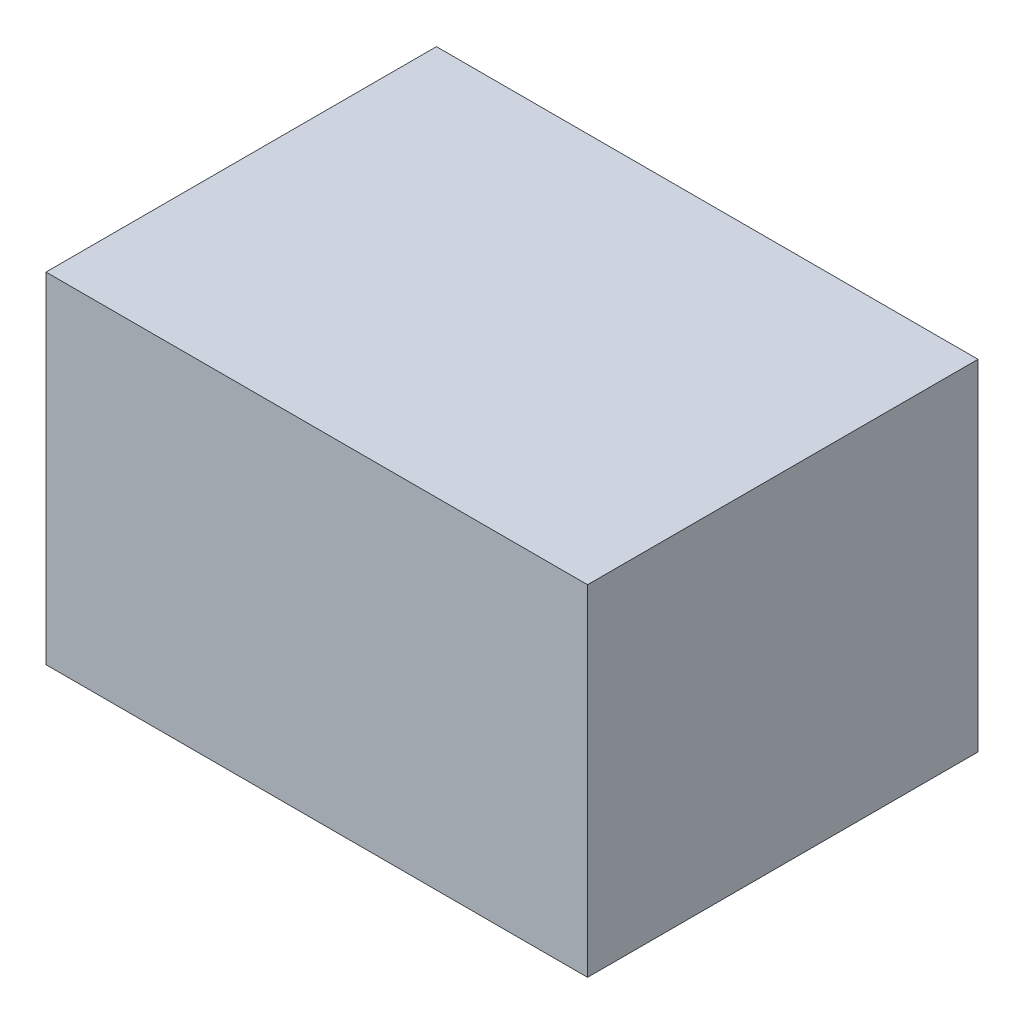
ISO-10303-21;
HEADER;
FILE_DESCRIPTION(('STEP AP214'),'2;1');
FILE_NAME('part.step','',(''),(''),'','','');
FILE_SCHEMA(('AUTOMOTIVE_DESIGN { 1 0 10303 214 1 1 1 1 }'));
ENDSEC;
DATA;
#1=APPLICATION_CONTEXT('core data for automotive mechanical design processes');
#2=APPLICATION_PROTOCOL_DEFINITION('international standard','automotive_design',2000,#1);
#3=PRODUCT_CONTEXT('',#1,'mechanical');
#4=PRODUCT('Part','Part','',(#3));
#5=PRODUCT_RELATED_PRODUCT_CATEGORY('part','',(#4));
#6=PRODUCT_DEFINITION_FORMATION('','',#4);
#7=PRODUCT_DEFINITION_CONTEXT('part definition',#1,'design');
#8=PRODUCT_DEFINITION('design','',#6,#7);
#9=PRODUCT_DEFINITION_SHAPE('','',#8);
#10=(LENGTH_UNIT() NAMED_UNIT(*) SI_UNIT(.MILLI.,.METRE.));
#11=(NAMED_UNIT(*) PLANE_ANGLE_UNIT() SI_UNIT($,.RADIAN.));
#12=(NAMED_UNIT(*) SI_UNIT($,.STERADIAN.) SOLID_ANGLE_UNIT());
#13=UNCERTAINTY_MEASURE_WITH_UNIT(LENGTH_MEASURE(1.E-05),#10,'distance_accuracy_value','');
#14=(GEOMETRIC_REPRESENTATION_CONTEXT(3) GLOBAL_UNCERTAINTY_ASSIGNED_CONTEXT((#13)) GLOBAL_UNIT_ASSIGNED_CONTEXT((#10,
#11,#12)) REPRESENTATION_CONTEXT('',''));
#15=CARTESIAN_POINT('',(0.,0.,0.));
#16=DIRECTION('',(0.,0.,1.));
#17=DIRECTION('',(1.,0.,0.));
#18=AXIS2_PLACEMENT_3D('',#15,#16,#17);
#19=CARTESIAN_POINT('',(8.60000058,5.39999936,0.));
#20=DIRECTION('',(0.,-1.,0.));
#21=DIRECTION('',(0.,0.,-1.));
#22=AXIS2_PLACEMENT_3D('',#19,#20,#21);
#23=PLANE('',#22);
#24=DIRECTION('',(0.,0.,-1.));
#25=VECTOR('',#24,1.);
#26=CARTESIAN_POINT('',(-8.60000058,5.39999936,0.));
#27=LINE('',#26,#25);
#28=CARTESIAN_POINT('',(-8.60000058,5.39999936,0.));
#29=VERTEX_POINT('',#28);
#30=CARTESIAN_POINT('',(-8.60000058,5.39999936,12.4000006));
#31=VERTEX_POINT('',#30);
#32=EDGE_CURVE('E19',#29,#31,#27,.F.);
#33=ORIENTED_EDGE('',*,*,#32,.T.);
#34=DIRECTION('',(-1.,0.,0.));
#35=VECTOR('',#34,1.);
#36=CARTESIAN_POINT('',(-8.60000058,5.39999936,12.4000006));
#37=LINE('',#36,#35);
#38=CARTESIAN_POINT('',(8.60000058,5.39999936,12.4000006));
#39=VERTEX_POINT('',#38);
#40=EDGE_CURVE('E54',#31,#39,#37,.F.);
#41=ORIENTED_EDGE('',*,*,#40,.T.);
#42=DIRECTION('',(0.,0.,1.));
#43=VECTOR('',#42,1.);
#44=CARTESIAN_POINT('',(8.60000058,5.39999936,0.));
#45=LINE('',#44,#43);
#46=CARTESIAN_POINT('',(8.60000058,5.39999936,0.));
#47=VERTEX_POINT('',#46);
#48=EDGE_CURVE('E73',#39,#47,#45,.F.);
#49=ORIENTED_EDGE('',*,*,#48,.T.);
#50=DIRECTION('',(-1.,0.,0.));
#51=VECTOR('',#50,1.);
#52=CARTESIAN_POINT('',(-8.60000058,5.39999936,0.));
#53=LINE('',#52,#51);
#54=EDGE_CURVE('E65',#29,#47,#53,.F.);
#55=ORIENTED_EDGE('',*,*,#54,.F.);
#56=EDGE_LOOP('',(#33,#41,#49,#55));
#57=FACE_BOUND('',#56,.T.);
#58=ADVANCED_FACE('F16',(#57),#23,.F.);
#59=CARTESIAN_POINT('',(-8.60000058,5.39999936,0.));
#60=DIRECTION('',(1.,0.,0.));
#61=DIRECTION('',(0.,0.,-1.));
#62=AXIS2_PLACEMENT_3D('',#59,#60,#61);
#63=PLANE('',#62);
#64=DIRECTION('',(0.,0.,1.));
#65=VECTOR('',#64,1.);
#66=CARTESIAN_POINT('',(-8.60000058,-5.39999936,0.));
#67=LINE('',#66,#65);
#68=CARTESIAN_POINT('',(-8.60000058,-5.39999936,0.));
#69=VERTEX_POINT('',#68);
#70=CARTESIAN_POINT('',(-8.60000058,-5.39999936,12.4000006));
#71=VERTEX_POINT('',#70);
#72=EDGE_CURVE('E71',#69,#71,#67,.T.);
#73=ORIENTED_EDGE('',*,*,#72,.T.);
#74=DIRECTION('',(0.,1.,0.));
#75=VECTOR('',#74,1.);
#76=CARTESIAN_POINT('',(-8.60000058,5.39999936,12.4000006));
#77=LINE('',#76,#75);
#78=EDGE_CURVE('E61',#71,#31,#77,.T.);
#79=ORIENTED_EDGE('',*,*,#78,.T.);
#80=ORIENTED_EDGE('',*,*,#32,.F.);
#81=DIRECTION('',(0.,1.,0.));
#82=VECTOR('',#81,1.);
#83=CARTESIAN_POINT('',(-8.60000058,5.39999936,0.));
#84=LINE('',#83,#82);
#85=EDGE_CURVE('E79',#69,#29,#84,.T.);
#86=ORIENTED_EDGE('',*,*,#85,.F.);
#87=EDGE_LOOP('',(#73,#79,#80,#86));
#88=FACE_BOUND('',#87,.T.);
#89=ADVANCED_FACE('F70',(#88),#63,.F.);
#90=CARTESIAN_POINT('',(-8.60000058,5.39999936,12.4000006));
#91=DIRECTION('',(0.,0.,-1.));
#92=DIRECTION('',(-1.,0.,0.));
#93=AXIS2_PLACEMENT_3D('',#90,#91,#92);
#94=PLANE('',#93);
#95=DIRECTION('',(1.,0.,0.));
#96=VECTOR('',#95,1.);
#97=CARTESIAN_POINT('',(-8.60000058,-5.39999936,12.4000006));
#98=LINE('',#97,#96);
#99=CARTESIAN_POINT('',(8.60000058,-5.39999936,12.4000006));
#100=VERTEX_POINT('',#99);
#101=EDGE_CURVE('E82',#71,#100,#98,.T.);
#102=ORIENTED_EDGE('',*,*,#101,.T.);
#103=DIRECTION('',(0.,1.,0.));
#104=VECTOR('',#103,1.);
#105=CARTESIAN_POINT('',(8.60000058,-5.39999936,12.4000006));
#106=LINE('',#105,#104);
#107=EDGE_CURVE('E63',#100,#39,#106,.T.);
#108=ORIENTED_EDGE('',*,*,#107,.T.);
#109=ORIENTED_EDGE('',*,*,#40,.F.);
#110=ORIENTED_EDGE('',*,*,#78,.F.);
#111=EDGE_LOOP('',(#102,#108,#109,#110));
#112=FACE_BOUND('',#111,.T.);
#113=ADVANCED_FACE('F59',(#112),#94,.F.);
#114=CARTESIAN_POINT('',(8.60000058,-5.39999936,0.));
#115=DIRECTION('',(-1.,0.,0.));
#116=DIRECTION('',(0.,0.,1.));
#117=AXIS2_PLACEMENT_3D('',#114,#115,#116);
#118=PLANE('',#117);
#119=ORIENTED_EDGE('',*,*,#48,.F.);
#120=ORIENTED_EDGE('',*,*,#107,.F.);
#121=DIRECTION('',(0.,0.,1.));
#122=VECTOR('',#121,1.);
#123=CARTESIAN_POINT('',(8.60000058,-5.39999936,0.));
#124=LINE('',#123,#122);
#125=CARTESIAN_POINT('',(8.60000058,-5.39999936,0.));
#126=VERTEX_POINT('',#125);
#127=EDGE_CURVE('E25',#100,#126,#124,.F.);
#128=ORIENTED_EDGE('',*,*,#127,.T.);
#129=DIRECTION('',(0.,1.,0.));
#130=VECTOR('',#129,1.);
#131=CARTESIAN_POINT('',(8.60000058,5.39999936,0.));
#132=LINE('',#131,#130);
#133=EDGE_CURVE('E33',#47,#126,#132,.F.);
#134=ORIENTED_EDGE('',*,*,#133,.F.);
#135=EDGE_LOOP('',(#119,#120,#128,#134));
#136=FACE_BOUND('',#135,.T.);
#137=ADVANCED_FACE('F87',(#136),#118,.F.);
#138=CARTESIAN_POINT('',(-8.60000058,5.39999936,0.));
#139=DIRECTION('',(0.,0.,-1.));
#140=DIRECTION('',(-1.,0.,0.));
#141=AXIS2_PLACEMENT_3D('',#138,#139,#140);
#142=PLANE('',#141);
#143=DIRECTION('',(1.,0.,0.));
#144=VECTOR('',#143,1.);
#145=CARTESIAN_POINT('',(-8.60000058,-5.39999936,0.));
#146=LINE('',#145,#144);
#147=EDGE_CURVE('E11',#126,#69,#146,.F.);
#148=ORIENTED_EDGE('',*,*,#147,.T.);
#149=ORIENTED_EDGE('',*,*,#85,.T.);
#150=ORIENTED_EDGE('',*,*,#54,.T.);
#151=ORIENTED_EDGE('',*,*,#133,.T.);
#152=EDGE_LOOP('',(#148,#149,#150,#151));
#153=FACE_BOUND('',#152,.T.);
#154=ADVANCED_FACE('F90',(#153),#142,.T.);
#155=CARTESIAN_POINT('',(-8.60000058,-5.39999936,0.));
#156=DIRECTION('',(0.,1.,0.));
#157=DIRECTION('',(0.,0.,1.));
#158=AXIS2_PLACEMENT_3D('',#155,#156,#157);
#159=PLANE('',#158);
#160=ORIENTED_EDGE('',*,*,#127,.F.);
#161=ORIENTED_EDGE('',*,*,#101,.F.);
#162=ORIENTED_EDGE('',*,*,#72,.F.);
#163=ORIENTED_EDGE('',*,*,#147,.F.);
#164=EDGE_LOOP('',(#160,#161,#162,#163));
#165=FACE_BOUND('',#164,.T.);
#166=ADVANCED_FACE('F89',(#165),#159,.F.);
#167=CLOSED_SHELL('',(#58,#89,#113,#137,#154,#166));
#168=MANIFOLD_SOLID_BREP('B1',#167);
#169=ADVANCED_BREP_SHAPE_REPRESENTATION('',(#18,#168),#14);
#170=SHAPE_DEFINITION_REPRESENTATION(#9,#169);
ENDSEC;
END-ISO-10303-21;
